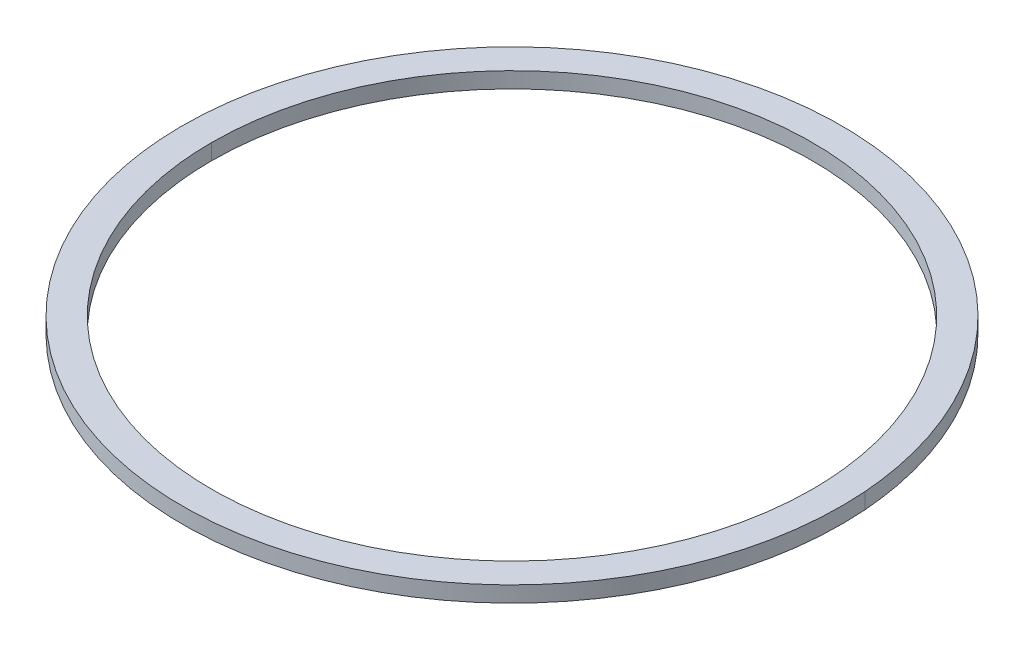
ISO-10303-21;
HEADER;
FILE_DESCRIPTION(('STEP AP214'),'2;1');
FILE_NAME('part.step','',(''),(''),'','','');
FILE_SCHEMA(('AUTOMOTIVE_DESIGN { 1 0 10303 214 1 1 1 1 }'));
ENDSEC;
DATA;
#1=APPLICATION_CONTEXT('core data for automotive mechanical design processes');
#2=APPLICATION_PROTOCOL_DEFINITION('international standard','automotive_design',2000,#1);
#3=PRODUCT_CONTEXT('',#1,'mechanical');
#4=PRODUCT('Part','Part','',(#3));
#5=PRODUCT_RELATED_PRODUCT_CATEGORY('part','',(#4));
#6=PRODUCT_DEFINITION_FORMATION('','',#4);
#7=PRODUCT_DEFINITION_CONTEXT('part definition',#1,'design');
#8=PRODUCT_DEFINITION('design','',#6,#7);
#9=PRODUCT_DEFINITION_SHAPE('','',#8);
#10=(LENGTH_UNIT() NAMED_UNIT(*) SI_UNIT(.MILLI.,.METRE.));
#11=(NAMED_UNIT(*) PLANE_ANGLE_UNIT() SI_UNIT($,.RADIAN.));
#12=(NAMED_UNIT(*) SI_UNIT($,.STERADIAN.) SOLID_ANGLE_UNIT());
#13=UNCERTAINTY_MEASURE_WITH_UNIT(LENGTH_MEASURE(1.E-05),#10,'distance_accuracy_value','');
#14=(GEOMETRIC_REPRESENTATION_CONTEXT(3) GLOBAL_UNCERTAINTY_ASSIGNED_CONTEXT((#13)) GLOBAL_UNIT_ASSIGNED_CONTEXT((#10,
#11,#12)) REPRESENTATION_CONTEXT('',''));
#15=CARTESIAN_POINT('',(0.,0.,0.));
#16=DIRECTION('',(0.,0.,1.));
#17=DIRECTION('',(1.,0.,0.));
#18=AXIS2_PLACEMENT_3D('',#15,#16,#17);
#19=CARTESIAN_POINT('',(-3.978997237075E-12,-61.3,1.090321272312E-12));
#20=DIRECTION('',(0.,-1.,0.));
#21=DIRECTION('',(0.,0.,-1.));
#22=AXIS2_PLACEMENT_3D('',#19,#20,#21);
#23=PLANE('',#22);
#24=CARTESIAN_POINT('',(179.889902315095,-61.3,106.960195673419));
#25=DIRECTION('',(0.,-1.,0.));
#26=DIRECTION('',(0.0145858252389278,0.,-0.999893621192824));
#27=AXIS2_PLACEMENT_3D('',#24,#25,#26);
#28=ELLIPSE('',#27,9.50003784577497,9.500037791911);
#29=CARTESIAN_POINT('',(170.390006513244,-61.3003599816747,106.959999926201));
#30=VERTEX_POINT('',#29);
#31=CARTESIAN_POINT('',(189.390081903752,-61.3003209489988,106.95999994083));
#32=VERTEX_POINT('',#31);
#33=EDGE_CURVE('E171',#30,#32,#28,.F.);
#34=ORIENTED_EDGE('',*,*,#33,.T.);
#35=CARTESIAN_POINT('',(179.890098258743,-61.3,106.959802792896));
#36=DIRECTION('',(0.,-1.,0.));
#37=DIRECTION('',(-0.041348260569677,0.,0.999144794986123));
#38=AXIS2_PLACEMENT_3D('',#35,#36,#37);
#39=ELLIPSE('',#38,9.50003850581068,9.500038455112);
#40=EDGE_CURVE('E70',#32,#30,#39,.F.);
#41=ORIENTED_EDGE('',*,*,#40,.T.);
#42=EDGE_LOOP('',(#34,#41));
#43=FACE_BOUND('',#42,.T.);
#44=CARTESIAN_POINT('',(179.889878178036,-61.3,106.95979200999));
#45=DIRECTION('',(0.,-1.,0.));
#46=DIRECTION('',(0.106266848919978,0.,0.99433764729121));
#47=AXIS2_PLACEMENT_3D('',#44,#45,#46);
#48=ELLIPSE('',#47,10.4232723480759,10.42327228115);
#49=CARTESIAN_POINT('',(190.285175100204,-61.3003833296483,106.19451149818));
#50=VERTEX_POINT('',#49);
#51=CARTESIAN_POINT('',(169.494924000389,-61.3004305835427,107.725481380628));
#52=VERTEX_POINT('',#51);
#53=EDGE_CURVE('E61',#50,#52,#48,.F.);
#54=ORIENTED_EDGE('',*,*,#53,.F.);
#55=CARTESIAN_POINT('',(179.890123407026,-61.3,106.960207870468));
#56=DIRECTION('',(0.,-1.,0.));
#57=DIRECTION('',(-0.11461375708195,0.,-0.99341013015147));
#58=AXIS2_PLACEMENT_3D('',#55,#56,#57);
#59=ELLIPSE('',#58,10.4232729092027,10.42327284224);
#60=EDGE_CURVE('E56',#52,#50,#59,.F.);
#61=ORIENTED_EDGE('',*,*,#60,.F.);
#62=EDGE_LOOP('',(#54,#61));
#63=FACE_BOUND('',#62,.T.);
#64=ADVANCED_FACE('F17',(#43,#63),#23,.T.);
#65=CARTESIAN_POINT('',(179.8901201591,-61.05,106.9601797192));
#66=DIRECTION('',(-1.29917039534894E-05,0.999999993575657,-0.000112605071536895));
#67=DIRECTION('',(0.,0.000112605071546398,0.999999993660049));
#68=AXIS2_PLACEMENT_3D('',#65,#66,#67);
#69=CYLINDRICAL_SURFACE('',#68,10.42327284224);
#70=CARTESIAN_POINT('',(169.494768397532,-61.3008330389233,107.725492842292));
#71=CARTESIAN_POINT('',(169.494768474908,-61.2799650177351,107.725492832525));
#72=CARTESIAN_POINT('',(169.494768552284,-61.259096996547,107.725492822758));
#73=CARTESIAN_POINT('',(169.494768707039,-61.2173609541707,107.725492803224));
#74=CARTESIAN_POINT('',(169.494768784417,-61.1964929329826,107.725492793457));
#75=CARTESIAN_POINT('',(169.494768939175,-61.1547568906063,107.725492773922));
#76=CARTESIAN_POINT('',(169.494769016554,-61.1338888694182,107.725492764155));
#77=CARTESIAN_POINT('',(169.494769171315,-61.0921528270419,107.725492744621));
#78=CARTESIAN_POINT('',(169.494769248697,-61.0712848058538,107.725492734853));
#79=CARTESIAN_POINT('',(169.494769403461,-61.0295487634775,107.725492715318));
#80=CARTESIAN_POINT('',(169.494769480844,-61.0086807422894,107.725492705551));
#81=CARTESIAN_POINT('',(169.494769635611,-60.9669446999131,107.725492686016));
#82=CARTESIAN_POINT('',(169.494769712996,-60.9460766787249,107.725492676248));
#83=CARTESIAN_POINT('',(169.494769867766,-60.9043406363487,107.725492656713));
#84=CARTESIAN_POINT('',(169.494769945152,-60.8834726151605,107.725492646945));
#85=CARTESIAN_POINT('',(169.494770099926,-60.8417365727843,107.72549262741));
#86=CARTESIAN_POINT('',(169.494770177314,-60.8208685515961,107.725492617642));
#87=CARTESIAN_POINT('',(169.494770254703,-60.800000530408,107.725492607874));
#88=B_SPLINE_CURVE_WITH_KNOTS('',3,(#70,#71,#72,#73,#74,#75,#76,#77,#78,#79,#80,#81,#82,#83,#84,
#85,#86,#87),.UNSPECIFIED.,.F.,.F.,(4,2,2,2,2,2,2,2,4),(0.,0.0626040635648487,0.125208127129697,
0.187812190694539,0.250416254259388,0.313020317824237,0.375624381389086,0.438228444953927,
0.500832508518776),.UNSPECIFIED.);
#89=CARTESIAN_POINT('',(169.494870788191,-60.8000002791342,107.725485205631));
#90=VERTEX_POINT('',#89);
#91=EDGE_CURVE('E62',#52,#90,#88,.T.);
#92=ORIENTED_EDGE('',*,*,#91,.F.);
#93=ORIENTED_EDGE('',*,*,#60,.T.);
#94=CARTESIAN_POINT('',(190.285021610197,-60.800735911794,106.194522799974));
#95=CARTESIAN_POINT('',(190.285021532561,-60.821569221015,106.194522805599));
#96=CARTESIAN_POINT('',(190.285021454924,-60.842402530236,106.194522811224));
#97=CARTESIAN_POINT('',(190.285021299648,-60.884069148678,106.194522822474));
#98=CARTESIAN_POINT('',(190.285021222009,-60.904902457899,106.194522828099));
#99=CARTESIAN_POINT('',(190.28502106673,-60.946569076341,106.194522839349));
#100=CARTESIAN_POINT('',(190.28502098909,-60.967402385562,106.194522844974));
#101=CARTESIAN_POINT('',(190.285020833807,-61.009069004004,106.194522856224));
#102=CARTESIAN_POINT('',(190.285020756166,-61.029902313225,106.194522861849));
#103=CARTESIAN_POINT('',(190.28502060088,-61.071568931667,106.1945228731));
#104=CARTESIAN_POINT('',(190.285020523237,-61.092402240888,106.194522878725));
#105=CARTESIAN_POINT('',(190.285020367948,-61.13406885933,106.194522889976));
#106=CARTESIAN_POINT('',(190.285020290303,-61.154902168551,106.194522895602));
#107=CARTESIAN_POINT('',(190.285020135011,-61.196568786993,106.194522906853));
#108=CARTESIAN_POINT('',(190.285020057364,-61.2174020962141,106.194522912478));
#109=CARTESIAN_POINT('',(190.285019902069,-61.2590687146561,106.19452292373));
#110=CARTESIAN_POINT('',(190.285019824421,-61.2799020238771,106.194522929355));
#111=CARTESIAN_POINT('',(190.285019746772,-61.3007353330981,106.194522934981));
#112=B_SPLINE_CURVE_WITH_KNOTS('',3,(#94,#95,#96,#97,#98,#99,#100,#101,#102,#103,#104,#105,#106,
#107,#108,#109,#110,#111),.UNSPECIFIED.,.F.,.F.,(4,2,2,2,2,2,2,2,4),(0.,0.0624999276634527,
0.124999855326905,0.187499782990351,0.249999710653804,0.312499638317257,0.374999565980709,
0.437499493644155,0.499999421307608),.UNSPECIFIED.);
#113=CARTESIAN_POINT('',(190.285174096355,-60.8003830725187,106.194511572709));
#114=VERTEX_POINT('',#113);
#115=EDGE_CURVE('E68',#114,#50,#112,.T.);
#116=ORIENTED_EDGE('',*,*,#115,.F.);
#117=CARTESIAN_POINT('',(179.890116911174,-60.8,106.960151567932));
#118=DIRECTION('',(0.,-1.,0.));
#119=DIRECTION('',(-0.11461375708195,0.,-0.99341013015147));
#120=AXIS2_PLACEMENT_3D('',#117,#118,#119);
#121=ELLIPSE('',#120,10.4232729092027,10.42327284224);
#122=EDGE_CURVE('E75',#114,#90,#121,.T.);
#123=ORIENTED_EDGE('',*,*,#122,.T.);
#124=EDGE_LOOP('',(#92,#93,#116,#123));
#125=FACE_BOUND('',#124,.T.);
#126=ADVANCED_FACE('F74',(#125),#69,.T.);
#127=CARTESIAN_POINT('',(179.8898811886,-61.05,106.9598201798));
#128=DIRECTION('',(1.20422552167898E-05,0.999999993579187,0.000112679239499798));
#129=DIRECTION('',(0.,-0.000112679239507969,0.999999993651695));
#130=AXIS2_PLACEMENT_3D('',#127,#128,#129);
#131=CYLINDRICAL_SURFACE('',#130,10.42327228115);
#132=ORIENTED_EDGE('',*,*,#115,.T.);
#133=ORIENTED_EDGE('',*,*,#53,.T.);
#134=ORIENTED_EDGE('',*,*,#91,.T.);
#135=CARTESIAN_POINT('',(179.889884199164,-60.8,106.95984834961));
#136=DIRECTION('',(0.,-1.,0.));
#137=DIRECTION('',(0.106266848919978,0.,0.99433764729121));
#138=AXIS2_PLACEMENT_3D('',#135,#136,#137);
#139=ELLIPSE('',#138,10.4232723480759,10.42327228115);
#140=EDGE_CURVE('E163',#90,#114,#139,.T.);
#141=ORIENTED_EDGE('',*,*,#140,.T.);
#142=EDGE_LOOP('',(#132,#133,#134,#141));
#143=FACE_BOUND('',#142,.T.);
#144=ADVANCED_FACE('F64',(#143),#131,.T.);
#145=CARTESIAN_POINT('',(179.8900971908,-61.05,106.9598285988));
#146=DIRECTION('',(-4.27177013923608E-06,0.999999994663319,0.000103223614275202));
#147=DIRECTION('',(0.,-0.000103223614276144,0.999999994672443));
#148=AXIS2_PLACEMENT_3D('',#145,#146,#147);
#149=CYLINDRICAL_SURFACE('',#148,9.500038455112);
#150=CARTESIAN_POINT('',(179.890096122857,-60.8,106.959854404704));
#151=DIRECTION('',(0.,-1.,0.));
#152=DIRECTION('',(-0.041348260569677,0.,0.999144794986123));
#153=AXIS2_PLACEMENT_3D('',#150,#151,#152);
#154=ELLIPSE('',#153,9.50003850581068,9.500038455112);
#155=CARTESIAN_POINT('',(189.390080677189,-60.8003207107798,106.959999939809));
#156=VERTEX_POINT('',#155);
#157=CARTESIAN_POINT('',(170.390005287381,-60.8003596511025,106.959999927461));
#158=VERTEX_POINT('',#157);
#159=EDGE_CURVE('E26',#156,#158,#154,.F.);
#160=ORIENTED_EDGE('',*,*,#159,.T.);
#161=CARTESIAN_POINT('',(170.390057671733,-60.80069249226,106.9599999276));
#162=CARTESIAN_POINT('',(170.390057760761,-60.8215258226375,106.959999927587));
#163=CARTESIAN_POINT('',(170.39005784979,-60.842359153015,106.959999927575));
#164=CARTESIAN_POINT('',(170.390058027849,-60.88402581377,106.95999992755));
#165=CARTESIAN_POINT('',(170.390058116879,-60.9048591441475,106.959999927538));
#166=CARTESIAN_POINT('',(170.390058294941,-60.9465258049025,106.959999927512));
#167=CARTESIAN_POINT('',(170.390058383973,-60.96735913528,106.9599999275));
#168=CARTESIAN_POINT('',(170.390058562038,-61.009025796035,106.959999927475));
#169=CARTESIAN_POINT('',(170.390058651071,-61.0298591264125,106.959999927462));
#170=CARTESIAN_POINT('',(170.390058829139,-61.0715257871675,106.959999927437));
#171=CARTESIAN_POINT('',(170.390058918174,-61.092359117545,106.959999927425));
#172=CARTESIAN_POINT('',(170.390059096245,-61.1340257783,106.9599999274));
#173=CARTESIAN_POINT('',(170.390059185281,-61.1548591086775,106.959999927387));
#174=CARTESIAN_POINT('',(170.390059363355,-61.1965257694325,106.959999927363));
#175=CARTESIAN_POINT('',(170.390059452393,-61.21735909981,106.95999992735));
#176=CARTESIAN_POINT('',(170.39005963047,-61.259025760565,106.959999927325));
#177=CARTESIAN_POINT('',(170.390059719509,-61.2798590909425,106.959999927312));
#178=CARTESIAN_POINT('',(170.390059808548,-61.30069242132,106.9599999273));
#179=B_SPLINE_CURVE_WITH_KNOTS('',3,(#161,#162,#163,#164,#165,#166,#167,#168,#169,#170,#171,
#172,#173,#174,#175,#176,#177,#178),.UNSPECIFIED.,.F.,.F.,(4,2,2,2,2,2,2,2,4),(0.,
0.0624999911330737,0.124999982266141,0.187499973399214,0.249999964532288,0.312499955665355,
0.374999946798429,0.437499937931496,0.49999992906457),.UNSPECIFIED.);
#180=EDGE_CURVE('E34',#158,#30,#179,.T.);
#181=ORIENTED_EDGE('',*,*,#180,.T.);
#182=ORIENTED_EDGE('',*,*,#40,.F.);
#183=CARTESIAN_POINT('',(189.390136714505,-61.30061125736,106.9599999397));
#184=CARTESIAN_POINT('',(189.390136625555,-61.2797779269825,106.959999939671));
#185=CARTESIAN_POINT('',(189.390136536604,-61.258944596605,106.959999939642));
#186=CARTESIAN_POINT('',(189.390136358699,-61.21727793585,106.959999939583));
#187=CARTESIAN_POINT('',(189.390136269747,-61.1964446054725,106.959999939554));
#188=CARTESIAN_POINT('',(189.39013609184,-61.1547779447175,106.959999939496));
#189=CARTESIAN_POINT('',(189.390136002886,-61.13394461434,106.959999939467));
#190=CARTESIAN_POINT('',(189.390135824976,-61.092277953585,106.959999939408));
#191=CARTESIAN_POINT('',(189.39013573602,-61.0714446232075,106.959999939379));
#192=CARTESIAN_POINT('',(189.390135558107,-61.0297779624525,106.959999939321));
#193=CARTESIAN_POINT('',(189.39013546915,-61.008944632075,106.959999939292));
#194=CARTESIAN_POINT('',(189.390135291234,-60.96727797132,106.959999939233));
#195=CARTESIAN_POINT('',(189.390135202276,-60.9464446409425,106.959999939204));
#196=CARTESIAN_POINT('',(189.390135024357,-60.9047779801875,106.959999939146));
#197=CARTESIAN_POINT('',(189.390134935397,-60.88394464981,106.959999939117));
#198=CARTESIAN_POINT('',(189.390134757476,-60.842277989055,106.959999939058));
#199=CARTESIAN_POINT('',(189.390134668514,-60.8214446586775,106.959999939029));
#200=CARTESIAN_POINT('',(189.390134579552,-60.8006113283,106.959999939));
#201=B_SPLINE_CURVE_WITH_KNOTS('',3,(#183,#184,#185,#186,#187,#188,#189,#190,#191,#192,#193,
#194,#195,#196,#197,#198,#199,#200),.UNSPECIFIED.,.F.,.F.,(4,2,2,2,2,2,2,2,4),(0.,
0.0624999911330727,0.124999982266139,0.187499973399211,0.249999964532284,0.31249995566535,
0.374999946798423,0.437499937931489,0.499999929064562),.UNSPECIFIED.);
#202=EDGE_CURVE('E118',#32,#156,#201,.T.);
#203=ORIENTED_EDGE('',*,*,#202,.T.);
#204=EDGE_LOOP('',(#160,#181,#182,#203));
#205=FACE_BOUND('',#204,.T.);
#206=ADVANCED_FACE('F127',(#205),#149,.F.);
#207=CARTESIAN_POINT('',(179.8899027034,-61.05,106.9601690542));
#208=DIRECTION('',(1.55321834663505E-06,0.999999994330131,-0.000106476876808803));
#209=DIRECTION('',(0.,0.000106476876808932,0.999999994331337));
#210=AXIS2_PLACEMENT_3D('',#207,#208,#209);
#211=CYLINDRICAL_SURFACE('',#210,9.500037791911);
#212=CARTESIAN_POINT('',(179.889903091705,-60.8,106.960142434981));
#213=DIRECTION('',(0.,-1.,0.));
#214=DIRECTION('',(0.0145858252389278,0.,-0.999893621192824));
#215=AXIS2_PLACEMENT_3D('',#212,#213,#214);
#216=ELLIPSE('',#215,9.50003784577497,9.500037791911);
#217=EDGE_CURVE('E11',#158,#156,#216,.F.);
#218=ORIENTED_EDGE('',*,*,#217,.T.);
#219=ORIENTED_EDGE('',*,*,#202,.F.);
#220=ORIENTED_EDGE('',*,*,#33,.F.);
#221=ORIENTED_EDGE('',*,*,#180,.F.);
#222=EDGE_LOOP('',(#218,#219,#220,#221));
#223=FACE_BOUND('',#222,.T.);
#224=ADVANCED_FACE('F136',(#223),#211,.F.);
#225=CARTESIAN_POINT('',(-3.978997237075E-12,-60.8,1.090321272312E-12));
#226=DIRECTION('',(0.,-1.,0.));
#227=DIRECTION('',(0.,0.,-1.));
#228=AXIS2_PLACEMENT_3D('',#225,#226,#227);
#229=PLANE('',#228);
#230=ORIENTED_EDGE('',*,*,#159,.F.);
#231=ORIENTED_EDGE('',*,*,#217,.F.);
#232=EDGE_LOOP('',(#230,#231));
#233=FACE_BOUND('',#232,.T.);
#234=ORIENTED_EDGE('',*,*,#122,.F.);
#235=ORIENTED_EDGE('',*,*,#140,.F.);
#236=EDGE_LOOP('',(#234,#235));
#237=FACE_BOUND('',#236,.T.);
#238=ADVANCED_FACE('F141',(#233,#237),#229,.F.);
#239=CLOSED_SHELL('',(#64,#126,#144,#206,#224,#238));
#240=MANIFOLD_SOLID_BREP('B1',#239);
#241=ADVANCED_BREP_SHAPE_REPRESENTATION('',(#18,#240),#14);
#242=SHAPE_DEFINITION_REPRESENTATION(#9,#241);
ENDSEC;
END-ISO-10303-21;
